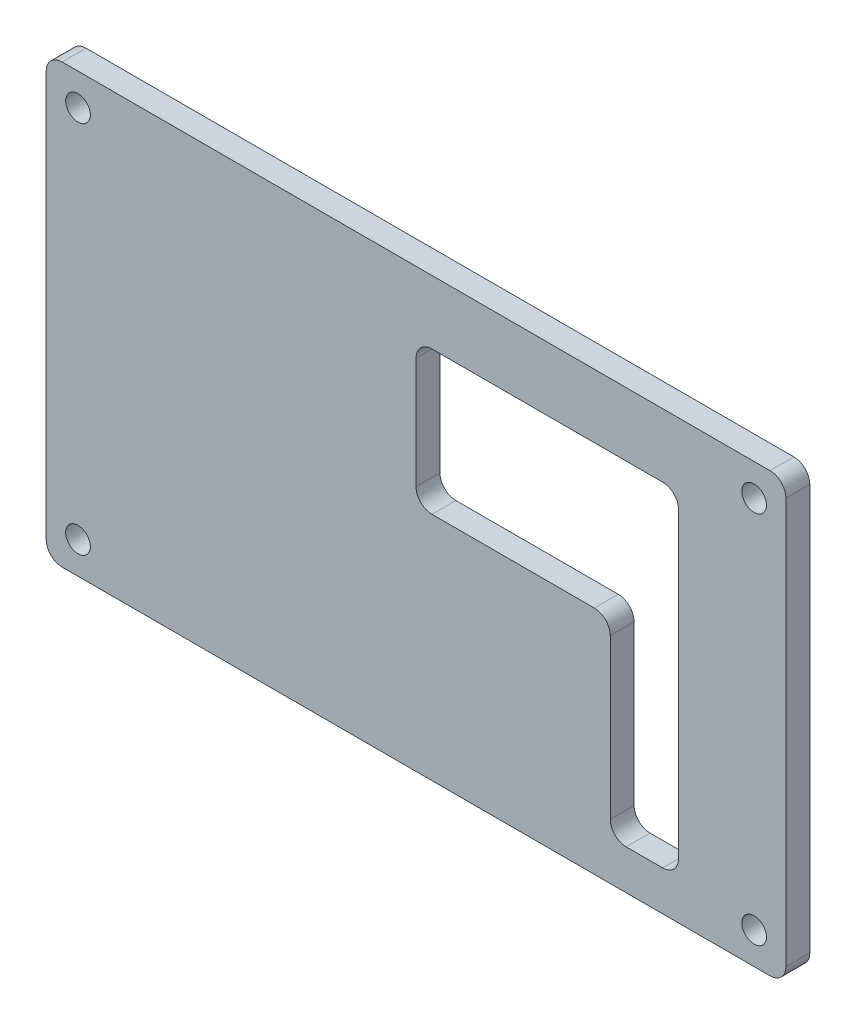
ISO-10303-21;
HEADER;
FILE_DESCRIPTION(('STEP AP214'),'2;1');
FILE_NAME('part.step','',(''),(''),'','','');
FILE_SCHEMA(('AUTOMOTIVE_DESIGN { 1 0 10303 214 1 1 1 1 }'));
ENDSEC;
DATA;
#1=APPLICATION_CONTEXT('core data for automotive mechanical design processes');
#2=APPLICATION_PROTOCOL_DEFINITION('international standard','automotive_design',2000,#1);
#3=PRODUCT_CONTEXT('',#1,'mechanical');
#4=PRODUCT('Part','Part','',(#3));
#5=PRODUCT_RELATED_PRODUCT_CATEGORY('part','',(#4));
#6=PRODUCT_DEFINITION_FORMATION('','',#4);
#7=PRODUCT_DEFINITION_CONTEXT('part definition',#1,'design');
#8=PRODUCT_DEFINITION('design','',#6,#7);
#9=PRODUCT_DEFINITION_SHAPE('','',#8);
#10=(LENGTH_UNIT() NAMED_UNIT(*) SI_UNIT(.MILLI.,.METRE.));
#11=(NAMED_UNIT(*) PLANE_ANGLE_UNIT() SI_UNIT($,.RADIAN.));
#12=(NAMED_UNIT(*) SI_UNIT($,.STERADIAN.) SOLID_ANGLE_UNIT());
#13=UNCERTAINTY_MEASURE_WITH_UNIT(LENGTH_MEASURE(1.E-05),#10,'distance_accuracy_value','');
#14=(GEOMETRIC_REPRESENTATION_CONTEXT(3) GLOBAL_UNCERTAINTY_ASSIGNED_CONTEXT((#13)) GLOBAL_UNIT_ASSIGNED_CONTEXT((#10,
#11,#12)) REPRESENTATION_CONTEXT('',''));
#15=CARTESIAN_POINT('',(0.,0.,0.));
#16=DIRECTION('',(0.,0.,1.));
#17=DIRECTION('',(1.,0.,0.));
#18=AXIS2_PLACEMENT_3D('',#15,#16,#17);
#19=CARTESIAN_POINT('',(44.5000000000009,25.5000000000001,3.));
#20=DIRECTION('',(0.,0.,1.));
#21=DIRECTION('',(1.,0.,0.));
#22=AXIS2_PLACEMENT_3D('',#19,#20,#21);
#23=PLANE('',#22);
#24=CARTESIAN_POINT('',(42.4999999999991,23.5000000000001,3.));
#25=DIRECTION('',(0.,0.,1.));
#26=DIRECTION('',(1.,0.,0.));
#27=AXIS2_PLACEMENT_3D('',#24,#25,#26);
#28=CIRCLE('',#27,1.54999999999994);
#29=CARTESIAN_POINT('',(44.049999999999,23.5000000000001,3.));
#30=VERTEX_POINT('',#29);
#31=EDGE_CURVE('E269',#30,#30,#28,.T.);
#32=ORIENTED_EDGE('',*,*,#31,.F.);
#33=EDGE_LOOP('',(#32));
#34=FACE_BOUND('',#33,.T.);
#35=CARTESIAN_POINT('',(-42.5000000000009,23.5000000000001,3.));
#36=DIRECTION('',(0.,0.,1.));
#37=DIRECTION('',(1.,0.,0.));
#38=AXIS2_PLACEMENT_3D('',#35,#36,#37);
#39=CIRCLE('',#38,1.54999999999994);
#40=CARTESIAN_POINT('',(-40.9500000000009,23.5000000000001,3.));
#41=VERTEX_POINT('',#40);
#42=EDGE_CURVE('E281',#41,#41,#39,.T.);
#43=ORIENTED_EDGE('',*,*,#42,.F.);
#44=EDGE_LOOP('',(#43));
#45=FACE_BOUND('',#44,.T.);
#46=CARTESIAN_POINT('',(44.5000000000009,25.5000000000001,3.));
#47=DIRECTION('',(0.,0.,1.));
#48=DIRECTION('',(1.,0.,0.));
#49=AXIS2_PLACEMENT_3D('',#46,#47,#48);
#50=CIRCLE('',#49,2.00000000000021);
#51=CARTESIAN_POINT('',(46.5000000000011,25.5000000000001,3.));
#52=VERTEX_POINT('',#51);
#53=CARTESIAN_POINT('',(44.5000000000009,27.5000000000003,3.));
#54=VERTEX_POINT('',#53);
#55=EDGE_CURVE('E287',#52,#54,#50,.T.);
#56=ORIENTED_EDGE('',*,*,#55,.T.);
#57=DIRECTION('',(-1.,0.,0.));
#58=VECTOR('',#57,1.);
#59=CARTESIAN_POINT('',(44.5000000000009,27.5000000000003,3.));
#60=LINE('',#59,#58);
#61=CARTESIAN_POINT('',(-44.4999999999995,27.5000000000001,3.));
#62=VERTEX_POINT('',#61);
#63=EDGE_CURVE('E290',#54,#62,#60,.T.);
#64=ORIENTED_EDGE('',*,*,#63,.T.);
#65=CARTESIAN_POINT('',(-44.4999999999995,25.5000000000001,3.));
#66=DIRECTION('',(0.,0.,1.));
#67=DIRECTION('',(1.,0.,0.));
#68=AXIS2_PLACEMENT_3D('',#65,#66,#67);
#69=CIRCLE('',#68,2.);
#70=CARTESIAN_POINT('',(-46.4999999999995,25.5000000000001,3.));
#71=VERTEX_POINT('',#70);
#72=EDGE_CURVE('E293',#62,#71,#69,.T.);
#73=ORIENTED_EDGE('',*,*,#72,.T.);
#74=DIRECTION('',(0.,-1.,0.));
#75=VECTOR('',#74,1.);
#76=CARTESIAN_POINT('',(-46.4999999999995,25.5000000000001,3.));
#77=LINE('',#76,#75);
#78=CARTESIAN_POINT('',(-46.4999999999995,-25.5,3.));
#79=VERTEX_POINT('',#78);
#80=EDGE_CURVE('E295',#71,#79,#77,.T.);
#81=ORIENTED_EDGE('',*,*,#80,.T.);
#82=CARTESIAN_POINT('',(-44.4999999999998,-25.5,3.));
#83=DIRECTION('',(0.,0.,1.));
#84=DIRECTION('',(1.,0.,0.));
#85=AXIS2_PLACEMENT_3D('',#82,#83,#84);
#86=CIRCLE('',#85,1.99999999999977);
#87=CARTESIAN_POINT('',(-44.4999999999998,-27.4999999999995,3.));
#88=VERTEX_POINT('',#87);
#89=EDGE_CURVE('E297',#79,#88,#86,.T.);
#90=ORIENTED_EDGE('',*,*,#89,.T.);
#91=DIRECTION('',(1.,0.,0.));
#92=VECTOR('',#91,1.);
#93=CARTESIAN_POINT('',(-44.4999999999998,-27.4999999999995,3.));
#94=LINE('',#93,#92);
#95=CARTESIAN_POINT('',(44.5000000000011,-27.4999999999997,3.));
#96=VERTEX_POINT('',#95);
#97=EDGE_CURVE('E299',#88,#96,#94,.T.);
#98=ORIENTED_EDGE('',*,*,#97,.T.);
#99=CARTESIAN_POINT('',(44.5000000000011,-25.5,3.));
#100=DIRECTION('',(0.,0.,1.));
#101=DIRECTION('',(1.,0.,0.));
#102=AXIS2_PLACEMENT_3D('',#99,#100,#101);
#103=CIRCLE('',#102,1.99999999999976);
#104=CARTESIAN_POINT('',(46.5000000000004,-25.4999999999995,3.));
#105=VERTEX_POINT('',#104);
#106=EDGE_CURVE('E301',#96,#105,#103,.T.);
#107=ORIENTED_EDGE('',*,*,#106,.T.);
#108=DIRECTION('',(0.,1.,0.));
#109=VECTOR('',#108,1.);
#110=CARTESIAN_POINT('',(46.5000000000004,-25.4999999999995,3.));
#111=LINE('',#110,#109);
#112=EDGE_CURVE('E303',#105,#52,#111,.T.);
#113=ORIENTED_EDGE('',*,*,#112,.T.);
#114=EDGE_LOOP('',(#56,#64,#73,#81,#90,#98,#107,#113));
#115=FACE_BOUND('',#114,.T.);
#116=CARTESIAN_POINT('',(-42.5000000000009,-23.5,3.));
#117=DIRECTION('',(0.,0.,1.));
#118=DIRECTION('',(1.,0.,0.));
#119=AXIS2_PLACEMENT_3D('',#116,#117,#118);
#120=CIRCLE('',#119,1.54999999999994);
#121=CARTESIAN_POINT('',(-40.9500000000009,-23.5,3.));
#122=VERTEX_POINT('',#121);
#123=EDGE_CURVE('E275',#122,#122,#120,.T.);
#124=ORIENTED_EDGE('',*,*,#123,.F.);
#125=EDGE_LOOP('',(#124));
#126=FACE_BOUND('',#125,.T.);
#127=CARTESIAN_POINT('',(42.4999999999991,-23.5,3.));
#128=DIRECTION('',(0.,0.,1.));
#129=DIRECTION('',(1.,0.,0.));
#130=AXIS2_PLACEMENT_3D('',#127,#128,#129);
#131=CIRCLE('',#130,1.54999999999994);
#132=CARTESIAN_POINT('',(44.049999999999,-23.5,3.));
#133=VERTEX_POINT('',#132);
#134=EDGE_CURVE('E263',#133,#133,#131,.T.);
#135=ORIENTED_EDGE('',*,*,#134,.F.);
#136=EDGE_LOOP('',(#135));
#137=FACE_BOUND('',#136,.T.);
#138=DIRECTION('',(0.,-1.,0.));
#139=VECTOR('',#138,1.);
#140=CARTESIAN_POINT('',(1.13103970633688E-12,17.5000000000012,3.));
#141=LINE('',#140,#139);
#142=CARTESIAN_POINT('',(1.13103970633688E-12,17.5000000000012,3.));
#143=VERTEX_POINT('',#142);
#144=CARTESIAN_POINT('',(9.14199271839777E-13,3.50000000000107,3.));
#145=VERTEX_POINT('',#144);
#146=EDGE_CURVE('E178',#143,#145,#141,.T.);
#147=ORIENTED_EDGE('',*,*,#146,.F.);
#148=CARTESIAN_POINT('',(2.00000000000135,17.5000000000005,3.));
#149=DIRECTION('',(0.,0.,1.));
#150=DIRECTION('',(1.,0.,0.));
#151=AXIS2_PLACEMENT_3D('',#148,#149,#150);
#152=CIRCLE('',#151,1.99999999999978);
#153=CARTESIAN_POINT('',(2.00000000000154,19.4999999999998,3.));
#154=VERTEX_POINT('',#153);
#155=EDGE_CURVE('E170',#154,#143,#152,.T.);
#156=ORIENTED_EDGE('',*,*,#155,.F.);
#157=DIRECTION('',(-1.,0.,0.));
#158=VECTOR('',#157,1.);
#159=CARTESIAN_POINT('',(31.0000000000017,19.4999999999998,3.));
#160=LINE('',#159,#158);
#161=CARTESIAN_POINT('',(31.0000000000017,19.4999999999998,3.));
#162=VERTEX_POINT('',#161);
#163=EDGE_CURVE('E211',#162,#154,#160,.T.);
#164=ORIENTED_EDGE('',*,*,#163,.F.);
#165=CARTESIAN_POINT('',(31.0000000000028,17.5000000000003,3.));
#166=DIRECTION('',(0.,0.,1.));
#167=DIRECTION('',(1.,0.,0.));
#168=AXIS2_PLACEMENT_3D('',#165,#166,#167);
#169=CIRCLE('',#168,1.99999999999973);
#170=CARTESIAN_POINT('',(33.0000000000025,17.5000000000012,3.));
#171=VERTEX_POINT('',#170);
#172=EDGE_CURVE('E209',#171,#162,#169,.T.);
#173=ORIENTED_EDGE('',*,*,#172,.F.);
#174=DIRECTION('',(0.,1.,0.));
#175=VECTOR('',#174,1.);
#176=CARTESIAN_POINT('',(33.0000000000027,-20.4999999999986,3.));
#177=LINE('',#176,#175);
#178=CARTESIAN_POINT('',(33.0000000000027,-20.4999999999986,3.));
#179=VERTEX_POINT('',#178);
#180=EDGE_CURVE('E207',#179,#171,#177,.T.);
#181=ORIENTED_EDGE('',*,*,#180,.F.);
#182=CARTESIAN_POINT('',(31.000000000003,-20.4999999999992,3.));
#183=DIRECTION('',(0.,0.,1.));
#184=DIRECTION('',(1.,0.,0.));
#185=AXIS2_PLACEMENT_3D('',#182,#183,#184);
#186=CIRCLE('',#185,2.00000000000022);
#187=CARTESIAN_POINT('',(31.000000000003,-22.4999999999994,3.));
#188=VERTEX_POINT('',#187);
#189=EDGE_CURVE('E205',#188,#179,#186,.T.);
#190=ORIENTED_EDGE('',*,*,#189,.F.);
#191=DIRECTION('',(1.,0.,0.));
#192=VECTOR('',#191,1.);
#193=CARTESIAN_POINT('',(26.4132142617397,-22.4999999999999,3.));
#194=LINE('',#193,#192);
#195=CARTESIAN_POINT('',(26.4132142617397,-22.4999999999999,3.));
#196=VERTEX_POINT('',#195);
#197=EDGE_CURVE('E203',#196,#188,#194,.T.);
#198=ORIENTED_EDGE('',*,*,#197,.F.);
#199=CARTESIAN_POINT('',(26.4132142617396,-20.4999999999992,3.));
#200=DIRECTION('',(0.,0.,1.));
#201=DIRECTION('',(1.,0.,0.));
#202=AXIS2_PLACEMENT_3D('',#199,#200,#201);
#203=CIRCLE('',#202,2.00000000000044);
#204=CARTESIAN_POINT('',(24.4132142617392,-20.4999999999984,3.));
#205=VERTEX_POINT('',#204);
#206=EDGE_CURVE('E201',#205,#196,#203,.T.);
#207=ORIENTED_EDGE('',*,*,#206,.F.);
#208=DIRECTION('',(0.,-1.,0.));
#209=VECTOR('',#208,1.);
#210=CARTESIAN_POINT('',(24.4132142617394,-0.499999999998928,3.));
#211=LINE('',#210,#209);
#212=CARTESIAN_POINT('',(24.4132142617394,-0.499999999998928,3.));
#213=VERTEX_POINT('',#212);
#214=EDGE_CURVE('E199',#213,#205,#211,.T.);
#215=ORIENTED_EDGE('',*,*,#214,.F.);
#216=CARTESIAN_POINT('',(22.4132142617396,-0.499999999999761,3.));
#217=DIRECTION('',(0.,0.,-1.));
#218=DIRECTION('',(1.,0.,0.));
#219=AXIS2_PLACEMENT_3D('',#216,#217,#218);
#220=CIRCLE('',#219,1.99999999999956);
#221=CARTESIAN_POINT('',(22.4132142617397,1.4999999999998,3.));
#222=VERTEX_POINT('',#221);
#223=EDGE_CURVE('E197',#222,#213,#220,.T.);
#224=ORIENTED_EDGE('',*,*,#223,.F.);
#225=DIRECTION('',(1.,0.,0.));
#226=VECTOR('',#225,1.);
#227=CARTESIAN_POINT('',(2.00000000000333,1.49999999999958,3.));
#228=LINE('',#227,#226);
#229=CARTESIAN_POINT('',(2.00000000000333,1.49999999999958,3.));
#230=VERTEX_POINT('',#229);
#231=EDGE_CURVE('E193',#230,#222,#228,.T.);
#232=ORIENTED_EDGE('',*,*,#231,.F.);
#233=CARTESIAN_POINT('',(2.00000000000136,3.50000000000024,3.));
#234=DIRECTION('',(0.,0.,1.));
#235=DIRECTION('',(1.,0.,0.));
#236=AXIS2_PLACEMENT_3D('',#233,#234,#235);
#237=CIRCLE('',#236,2.00000000000044);
#238=EDGE_CURVE('E191',#145,#230,#237,.T.);
#239=ORIENTED_EDGE('',*,*,#238,.F.);
#240=EDGE_LOOP('',(#147,#156,#164,#173,#181,#190,#198,#207,#215,#224,#232,#239));
#241=FACE_BOUND('',#240,.T.);
#242=ADVANCED_FACE('F33',(#34,#45,#115,#126,#137,#241),#23,.T.);
#243=CARTESIAN_POINT('',(44.5000000000009,25.5000000000001,0.));
#244=DIRECTION('',(0.,0.,1.));
#245=DIRECTION('',(1.,0.,0.));
#246=AXIS2_PLACEMENT_3D('',#243,#244,#245);
#247=PLANE('',#246);
#248=CARTESIAN_POINT('',(42.4999999999991,-23.5,0.));
#249=DIRECTION('',(0.,0.,1.));
#250=DIRECTION('',(1.,0.,0.));
#251=AXIS2_PLACEMENT_3D('',#248,#249,#250);
#252=CIRCLE('',#251,1.54999999999994);
#253=CARTESIAN_POINT('',(44.049999999999,-23.5,0.));
#254=VERTEX_POINT('',#253);
#255=EDGE_CURVE('E186',#254,#254,#252,.T.);
#256=ORIENTED_EDGE('',*,*,#255,.T.);
#257=EDGE_LOOP('',(#256));
#258=FACE_BOUND('',#257,.T.);
#259=CARTESIAN_POINT('',(42.4999999999991,23.5000000000001,0.));
#260=DIRECTION('',(0.,0.,1.));
#261=DIRECTION('',(1.,0.,0.));
#262=AXIS2_PLACEMENT_3D('',#259,#260,#261);
#263=CIRCLE('',#262,1.54999999999994);
#264=CARTESIAN_POINT('',(44.049999999999,23.5000000000001,0.));
#265=VERTEX_POINT('',#264);
#266=EDGE_CURVE('E266',#265,#265,#263,.T.);
#267=ORIENTED_EDGE('',*,*,#266,.T.);
#268=EDGE_LOOP('',(#267));
#269=FACE_BOUND('',#268,.T.);
#270=CARTESIAN_POINT('',(-42.5000000000009,-23.5,0.));
#271=DIRECTION('',(0.,0.,1.));
#272=DIRECTION('',(1.,0.,0.));
#273=AXIS2_PLACEMENT_3D('',#270,#271,#272);
#274=CIRCLE('',#273,1.54999999999994);
#275=CARTESIAN_POINT('',(-40.9500000000009,-23.5,0.));
#276=VERTEX_POINT('',#275);
#277=EDGE_CURVE('E272',#276,#276,#274,.T.);
#278=ORIENTED_EDGE('',*,*,#277,.T.);
#279=EDGE_LOOP('',(#278));
#280=FACE_BOUND('',#279,.T.);
#281=CARTESIAN_POINT('',(-42.5000000000009,23.5000000000001,0.));
#282=DIRECTION('',(0.,0.,1.));
#283=DIRECTION('',(1.,0.,0.));
#284=AXIS2_PLACEMENT_3D('',#281,#282,#283);
#285=CIRCLE('',#284,1.54999999999994);
#286=CARTESIAN_POINT('',(-40.9500000000009,23.5000000000001,0.));
#287=VERTEX_POINT('',#286);
#288=EDGE_CURVE('E278',#287,#287,#285,.T.);
#289=ORIENTED_EDGE('',*,*,#288,.T.);
#290=EDGE_LOOP('',(#289));
#291=FACE_BOUND('',#290,.T.);
#292=CARTESIAN_POINT('',(44.5000000000009,25.5000000000001,0.));
#293=DIRECTION('',(0.,0.,1.));
#294=DIRECTION('',(1.,0.,0.));
#295=AXIS2_PLACEMENT_3D('',#292,#293,#294);
#296=CIRCLE('',#295,2.00000000000021);
#297=CARTESIAN_POINT('',(46.5000000000011,25.5000000000001,0.));
#298=VERTEX_POINT('',#297);
#299=CARTESIAN_POINT('',(44.5000000000009,27.5000000000003,0.));
#300=VERTEX_POINT('',#299);
#301=EDGE_CURVE('E284',#298,#300,#296,.T.);
#302=ORIENTED_EDGE('',*,*,#301,.F.);
#303=DIRECTION('',(0.,1.,0.));
#304=VECTOR('',#303,1.);
#305=CARTESIAN_POINT('',(46.5000000000004,-25.4999999999995,0.));
#306=LINE('',#305,#304);
#307=CARTESIAN_POINT('',(46.5000000000004,-25.4999999999995,0.));
#308=VERTEX_POINT('',#307);
#309=EDGE_CURVE('E291',#308,#298,#306,.T.);
#310=ORIENTED_EDGE('',*,*,#309,.F.);
#311=CARTESIAN_POINT('',(44.5000000000011,-25.5,0.));
#312=DIRECTION('',(0.,0.,1.));
#313=DIRECTION('',(1.,0.,0.));
#314=AXIS2_PLACEMENT_3D('',#311,#312,#313);
#315=CIRCLE('',#314,1.99999999999976);
#316=CARTESIAN_POINT('',(44.5000000000011,-27.4999999999997,0.));
#317=VERTEX_POINT('',#316);
#318=EDGE_CURVE('E318',#317,#308,#315,.T.);
#319=ORIENTED_EDGE('',*,*,#318,.F.);
#320=DIRECTION('',(1.,0.,0.));
#321=VECTOR('',#320,1.);
#322=CARTESIAN_POINT('',(-44.4999999999998,-27.4999999999995,0.));
#323=LINE('',#322,#321);
#324=CARTESIAN_POINT('',(-44.4999999999998,-27.4999999999995,0.));
#325=VERTEX_POINT('',#324);
#326=EDGE_CURVE('E316',#325,#317,#323,.T.);
#327=ORIENTED_EDGE('',*,*,#326,.F.);
#328=CARTESIAN_POINT('',(-44.4999999999998,-25.5,0.));
#329=DIRECTION('',(0.,0.,1.));
#330=DIRECTION('',(1.,0.,0.));
#331=AXIS2_PLACEMENT_3D('',#328,#329,#330);
#332=CIRCLE('',#331,1.99999999999977);
#333=CARTESIAN_POINT('',(-46.4999999999995,-25.5,0.));
#334=VERTEX_POINT('',#333);
#335=EDGE_CURVE('E314',#334,#325,#332,.T.);
#336=ORIENTED_EDGE('',*,*,#335,.F.);
#337=DIRECTION('',(0.,-1.,0.));
#338=VECTOR('',#337,1.);
#339=CARTESIAN_POINT('',(-46.4999999999995,25.5000000000001,0.));
#340=LINE('',#339,#338);
#341=CARTESIAN_POINT('',(-46.4999999999995,25.5000000000001,0.));
#342=VERTEX_POINT('',#341);
#343=EDGE_CURVE('E312',#342,#334,#340,.T.);
#344=ORIENTED_EDGE('',*,*,#343,.F.);
#345=CARTESIAN_POINT('',(-44.4999999999995,25.5000000000001,0.));
#346=DIRECTION('',(0.,0.,1.));
#347=DIRECTION('',(1.,0.,0.));
#348=AXIS2_PLACEMENT_3D('',#345,#346,#347);
#349=CIRCLE('',#348,2.);
#350=CARTESIAN_POINT('',(-44.4999999999995,27.5000000000001,0.));
#351=VERTEX_POINT('',#350);
#352=EDGE_CURVE('E310',#351,#342,#349,.T.);
#353=ORIENTED_EDGE('',*,*,#352,.F.);
#354=DIRECTION('',(-1.,0.,0.));
#355=VECTOR('',#354,1.);
#356=CARTESIAN_POINT('',(44.5000000000009,27.5000000000003,0.));
#357=LINE('',#356,#355);
#358=EDGE_CURVE('E308',#300,#351,#357,.T.);
#359=ORIENTED_EDGE('',*,*,#358,.F.);
#360=EDGE_LOOP('',(#302,#310,#319,#327,#336,#344,#353,#359));
#361=FACE_BOUND('',#360,.T.);
#362=CARTESIAN_POINT('',(2.00000000000135,17.5000000000005,0.));
#363=DIRECTION('',(0.,0.,1.));
#364=DIRECTION('',(1.,0.,0.));
#365=AXIS2_PLACEMENT_3D('',#362,#363,#364);
#366=CIRCLE('',#365,1.99999999999978);
#367=CARTESIAN_POINT('',(2.00000000000154,19.4999999999998,0.));
#368=VERTEX_POINT('',#367);
#369=CARTESIAN_POINT('',(1.13103970633688E-12,17.5000000000012,0.));
#370=VERTEX_POINT('',#369);
#371=EDGE_CURVE('E56',#368,#370,#366,.T.);
#372=ORIENTED_EDGE('',*,*,#371,.T.);
#373=DIRECTION('',(0.,-1.,0.));
#374=VECTOR('',#373,1.);
#375=CARTESIAN_POINT('',(1.13103970633688E-12,17.5000000000012,0.));
#376=LINE('',#375,#374);
#377=CARTESIAN_POINT('',(9.14199271839777E-13,3.50000000000107,0.));
#378=VERTEX_POINT('',#377);
#379=EDGE_CURVE('E185',#370,#378,#376,.T.);
#380=ORIENTED_EDGE('',*,*,#379,.T.);
#381=CARTESIAN_POINT('',(2.00000000000136,3.50000000000024,0.));
#382=DIRECTION('',(0.,0.,1.));
#383=DIRECTION('',(1.,0.,0.));
#384=AXIS2_PLACEMENT_3D('',#381,#382,#383);
#385=CIRCLE('',#384,2.00000000000044);
#386=CARTESIAN_POINT('',(2.00000000000333,1.49999999999958,0.));
#387=VERTEX_POINT('',#386);
#388=EDGE_CURVE('E215',#378,#387,#385,.T.);
#389=ORIENTED_EDGE('',*,*,#388,.T.);
#390=DIRECTION('',(1.,0.,0.));
#391=VECTOR('',#390,1.);
#392=CARTESIAN_POINT('',(2.00000000000333,1.49999999999958,0.));
#393=LINE('',#392,#391);
#394=CARTESIAN_POINT('',(22.4132142617397,1.4999999999998,0.));
#395=VERTEX_POINT('',#394);
#396=EDGE_CURVE('E218',#387,#395,#393,.T.);
#397=ORIENTED_EDGE('',*,*,#396,.T.);
#398=CARTESIAN_POINT('',(22.4132142617396,-0.499999999999761,0.));
#399=DIRECTION('',(0.,0.,-1.));
#400=DIRECTION('',(1.,0.,0.));
#401=AXIS2_PLACEMENT_3D('',#398,#399,#400);
#402=CIRCLE('',#401,1.99999999999956);
#403=CARTESIAN_POINT('',(24.4132142617394,-0.499999999998928,0.));
#404=VERTEX_POINT('',#403);
#405=EDGE_CURVE('E221',#395,#404,#402,.T.);
#406=ORIENTED_EDGE('',*,*,#405,.T.);
#407=DIRECTION('',(0.,-1.,0.));
#408=VECTOR('',#407,1.);
#409=CARTESIAN_POINT('',(24.4132142617394,-0.499999999998928,0.));
#410=LINE('',#409,#408);
#411=CARTESIAN_POINT('',(24.4132142617392,-20.4999999999984,0.));
#412=VERTEX_POINT('',#411);
#413=EDGE_CURVE('E224',#404,#412,#410,.T.);
#414=ORIENTED_EDGE('',*,*,#413,.T.);
#415=CARTESIAN_POINT('',(26.4132142617396,-20.4999999999992,0.));
#416=DIRECTION('',(0.,0.,1.));
#417=DIRECTION('',(1.,0.,0.));
#418=AXIS2_PLACEMENT_3D('',#415,#416,#417);
#419=CIRCLE('',#418,2.00000000000044);
#420=CARTESIAN_POINT('',(26.4132142617397,-22.4999999999999,0.));
#421=VERTEX_POINT('',#420);
#422=EDGE_CURVE('E227',#412,#421,#419,.T.);
#423=ORIENTED_EDGE('',*,*,#422,.T.);
#424=DIRECTION('',(1.,0.,0.));
#425=VECTOR('',#424,1.);
#426=CARTESIAN_POINT('',(26.4132142617397,-22.4999999999999,0.));
#427=LINE('',#426,#425);
#428=CARTESIAN_POINT('',(31.000000000003,-22.4999999999994,0.));
#429=VERTEX_POINT('',#428);
#430=EDGE_CURVE('E230',#421,#429,#427,.T.);
#431=ORIENTED_EDGE('',*,*,#430,.T.);
#432=CARTESIAN_POINT('',(31.000000000003,-20.4999999999992,0.));
#433=DIRECTION('',(0.,0.,1.));
#434=DIRECTION('',(1.,0.,0.));
#435=AXIS2_PLACEMENT_3D('',#432,#433,#434);
#436=CIRCLE('',#435,2.00000000000022);
#437=CARTESIAN_POINT('',(33.0000000000027,-20.4999999999986,0.));
#438=VERTEX_POINT('',#437);
#439=EDGE_CURVE('E233',#429,#438,#436,.T.);
#440=ORIENTED_EDGE('',*,*,#439,.T.);
#441=DIRECTION('',(0.,1.,0.));
#442=VECTOR('',#441,1.);
#443=CARTESIAN_POINT('',(33.0000000000027,-20.4999999999986,0.));
#444=LINE('',#443,#442);
#445=CARTESIAN_POINT('',(33.0000000000025,17.5000000000012,0.));
#446=VERTEX_POINT('',#445);
#447=EDGE_CURVE('E236',#438,#446,#444,.T.);
#448=ORIENTED_EDGE('',*,*,#447,.T.);
#449=CARTESIAN_POINT('',(31.0000000000028,17.5000000000003,0.));
#450=DIRECTION('',(0.,0.,1.));
#451=DIRECTION('',(1.,0.,0.));
#452=AXIS2_PLACEMENT_3D('',#449,#450,#451);
#453=CIRCLE('',#452,1.99999999999973);
#454=CARTESIAN_POINT('',(31.0000000000017,19.4999999999998,0.));
#455=VERTEX_POINT('',#454);
#456=EDGE_CURVE('E239',#446,#455,#453,.T.);
#457=ORIENTED_EDGE('',*,*,#456,.T.);
#458=DIRECTION('',(-1.,0.,0.));
#459=VECTOR('',#458,1.);
#460=CARTESIAN_POINT('',(31.0000000000017,19.4999999999998,0.));
#461=LINE('',#460,#459);
#462=EDGE_CURVE('E179',#455,#368,#461,.T.);
#463=ORIENTED_EDGE('',*,*,#462,.T.);
#464=EDGE_LOOP('',(#372,#380,#389,#397,#406,#414,#423,#431,#440,#448,#457,#463));
#465=FACE_BOUND('',#464,.T.);
#466=ADVANCED_FACE('F348',(#258,#269,#280,#291,#361,#465),#247,.F.);
#467=CARTESIAN_POINT('',(44.5000000000009,25.5000000000001,3.));
#468=DIRECTION('',(0.,0.,-1.));
#469=DIRECTION('',(-1.,0.,0.));
#470=AXIS2_PLACEMENT_3D('',#467,#468,#469);
#471=CYLINDRICAL_SURFACE('',#470,2.00000000000021);
#472=ORIENTED_EDGE('',*,*,#301,.T.);
#473=DIRECTION('',(0.,0.,-1.));
#474=VECTOR('',#473,1.);
#475=CARTESIAN_POINT('',(44.5000000000009,27.5000000000003,3.));
#476=LINE('',#475,#474);
#477=EDGE_CURVE('E11',#54,#300,#476,.T.);
#478=ORIENTED_EDGE('',*,*,#477,.F.);
#479=ORIENTED_EDGE('',*,*,#55,.F.);
#480=DIRECTION('',(0.,0.,-1.));
#481=VECTOR('',#480,1.);
#482=CARTESIAN_POINT('',(46.5000000000011,25.5000000000001,3.));
#483=LINE('',#482,#481);
#484=EDGE_CURVE('E305',#52,#298,#483,.T.);
#485=ORIENTED_EDGE('',*,*,#484,.T.);
#486=EDGE_LOOP('',(#472,#478,#479,#485));
#487=FACE_BOUND('',#486,.T.);
#488=ADVANCED_FACE('F35',(#487),#471,.T.);
#489=CARTESIAN_POINT('',(44.5000000000009,27.5000000000003,3.));
#490=DIRECTION('',(0.,-1.,0.));
#491=DIRECTION('',(1.,0.,0.));
#492=AXIS2_PLACEMENT_3D('',#489,#490,#491);
#493=PLANE('',#492);
#494=ORIENTED_EDGE('',*,*,#358,.T.);
#495=DIRECTION('',(0.,0.,-1.));
#496=VECTOR('',#495,1.);
#497=CARTESIAN_POINT('',(-44.4999999999995,27.5000000000001,3.));
#498=LINE('',#497,#496);
#499=EDGE_CURVE('E41',#62,#351,#498,.T.);
#500=ORIENTED_EDGE('',*,*,#499,.F.);
#501=ORIENTED_EDGE('',*,*,#63,.F.);
#502=ORIENTED_EDGE('',*,*,#477,.T.);
#503=EDGE_LOOP('',(#494,#500,#501,#502));
#504=FACE_BOUND('',#503,.T.);
#505=ADVANCED_FACE('F366',(#504),#493,.F.);
#506=CARTESIAN_POINT('',(-44.4999999999995,25.5000000000001,3.));
#507=DIRECTION('',(0.,0.,-1.));
#508=DIRECTION('',(-1.,0.,0.));
#509=AXIS2_PLACEMENT_3D('',#506,#507,#508);
#510=CYLINDRICAL_SURFACE('',#509,2.);
#511=ORIENTED_EDGE('',*,*,#352,.T.);
#512=DIRECTION('',(0.,0.,-1.));
#513=VECTOR('',#512,1.);
#514=CARTESIAN_POINT('',(-46.4999999999995,25.5000000000001,3.));
#515=LINE('',#514,#513);
#516=EDGE_CURVE('E335',#71,#342,#515,.T.);
#517=ORIENTED_EDGE('',*,*,#516,.F.);
#518=ORIENTED_EDGE('',*,*,#72,.F.);
#519=ORIENTED_EDGE('',*,*,#499,.T.);
#520=EDGE_LOOP('',(#511,#517,#518,#519));
#521=FACE_BOUND('',#520,.T.);
#522=ADVANCED_FACE('F342',(#521),#510,.T.);
#523=CARTESIAN_POINT('',(-46.4999999999995,25.5000000000001,3.));
#524=DIRECTION('',(1.,0.,0.));
#525=DIRECTION('',(0.,1.,0.));
#526=AXIS2_PLACEMENT_3D('',#523,#524,#525);
#527=PLANE('',#526);
#528=ORIENTED_EDGE('',*,*,#343,.T.);
#529=DIRECTION('',(0.,0.,-1.));
#530=VECTOR('',#529,1.);
#531=CARTESIAN_POINT('',(-46.4999999999995,-25.5,3.));
#532=LINE('',#531,#530);
#533=EDGE_CURVE('E332',#79,#334,#532,.T.);
#534=ORIENTED_EDGE('',*,*,#533,.F.);
#535=ORIENTED_EDGE('',*,*,#80,.F.);
#536=ORIENTED_EDGE('',*,*,#516,.T.);
#537=EDGE_LOOP('',(#528,#534,#535,#536));
#538=FACE_BOUND('',#537,.T.);
#539=ADVANCED_FACE('F354',(#538),#527,.F.);
#540=CARTESIAN_POINT('',(-44.4999999999998,-25.5,3.));
#541=DIRECTION('',(0.,0.,-1.));
#542=DIRECTION('',(-1.,0.,0.));
#543=AXIS2_PLACEMENT_3D('',#540,#541,#542);
#544=CYLINDRICAL_SURFACE('',#543,1.99999999999977);
#545=ORIENTED_EDGE('',*,*,#335,.T.);
#546=DIRECTION('',(0.,0.,-1.));
#547=VECTOR('',#546,1.);
#548=CARTESIAN_POINT('',(-44.4999999999998,-27.4999999999995,3.));
#549=LINE('',#548,#547);
#550=EDGE_CURVE('E329',#88,#325,#549,.T.);
#551=ORIENTED_EDGE('',*,*,#550,.F.);
#552=ORIENTED_EDGE('',*,*,#89,.F.);
#553=ORIENTED_EDGE('',*,*,#533,.T.);
#554=EDGE_LOOP('',(#545,#551,#552,#553));
#555=FACE_BOUND('',#554,.T.);
#556=ADVANCED_FACE('F358',(#555),#544,.T.);
#557=CARTESIAN_POINT('',(-44.4999999999998,-27.4999999999995,3.));
#558=DIRECTION('',(0.,1.,0.));
#559=DIRECTION('',(-1.,0.,0.));
#560=AXIS2_PLACEMENT_3D('',#557,#558,#559);
#561=PLANE('',#560);
#562=ORIENTED_EDGE('',*,*,#326,.T.);
#563=DIRECTION('',(0.,0.,-1.));
#564=VECTOR('',#563,1.);
#565=CARTESIAN_POINT('',(44.5000000000011,-27.4999999999997,3.));
#566=LINE('',#565,#564);
#567=EDGE_CURVE('E326',#96,#317,#566,.T.);
#568=ORIENTED_EDGE('',*,*,#567,.F.);
#569=ORIENTED_EDGE('',*,*,#97,.F.);
#570=ORIENTED_EDGE('',*,*,#550,.T.);
#571=EDGE_LOOP('',(#562,#568,#569,#570));
#572=FACE_BOUND('',#571,.T.);
#573=ADVANCED_FACE('F379',(#572),#561,.F.);
#574=CARTESIAN_POINT('',(44.5000000000011,-25.5,3.));
#575=DIRECTION('',(0.,0.,-1.));
#576=DIRECTION('',(-1.,0.,0.));
#577=AXIS2_PLACEMENT_3D('',#574,#575,#576);
#578=CYLINDRICAL_SURFACE('',#577,1.99999999999976);
#579=ORIENTED_EDGE('',*,*,#318,.T.);
#580=DIRECTION('',(0.,0.,-1.));
#581=VECTOR('',#580,1.);
#582=CARTESIAN_POINT('',(46.5000000000004,-25.4999999999995,3.));
#583=LINE('',#582,#581);
#584=EDGE_CURVE('E323',#105,#308,#583,.T.);
#585=ORIENTED_EDGE('',*,*,#584,.F.);
#586=ORIENTED_EDGE('',*,*,#106,.F.);
#587=ORIENTED_EDGE('',*,*,#567,.T.);
#588=EDGE_LOOP('',(#579,#585,#586,#587));
#589=FACE_BOUND('',#588,.T.);
#590=ADVANCED_FACE('F377',(#589),#578,.T.);
#591=CARTESIAN_POINT('',(46.5000000000004,-25.4999999999995,3.));
#592=DIRECTION('',(-1.,0.,0.));
#593=DIRECTION('',(0.,-1.,0.));
#594=AXIS2_PLACEMENT_3D('',#591,#592,#593);
#595=PLANE('',#594);
#596=ORIENTED_EDGE('',*,*,#309,.T.);
#597=ORIENTED_EDGE('',*,*,#484,.F.);
#598=ORIENTED_EDGE('',*,*,#112,.F.);
#599=ORIENTED_EDGE('',*,*,#584,.T.);
#600=EDGE_LOOP('',(#596,#597,#598,#599));
#601=FACE_BOUND('',#600,.T.);
#602=ADVANCED_FACE('F372',(#601),#595,.F.);
#603=CARTESIAN_POINT('',(-42.5000000000009,23.5000000000001,3.));
#604=DIRECTION('',(0.,0.,-1.));
#605=DIRECTION('',(-1.,0.,0.));
#606=AXIS2_PLACEMENT_3D('',#603,#604,#605);
#607=CYLINDRICAL_SURFACE('',#606,1.54999999999994);
#608=ORIENTED_EDGE('',*,*,#42,.T.);
#609=EDGE_LOOP('',(#608));
#610=FACE_BOUND('',#609,.T.);
#611=ORIENTED_EDGE('',*,*,#288,.F.);
#612=EDGE_LOOP('',(#611));
#613=FACE_BOUND('',#612,.T.);
#614=ADVANCED_FACE('F399',(#610,#613),#607,.F.);
#615=CARTESIAN_POINT('',(-42.5000000000009,-23.5,3.));
#616=DIRECTION('',(0.,0.,-1.));
#617=DIRECTION('',(-1.,0.,0.));
#618=AXIS2_PLACEMENT_3D('',#615,#616,#617);
#619=CYLINDRICAL_SURFACE('',#618,1.54999999999994);
#620=ORIENTED_EDGE('',*,*,#123,.T.);
#621=EDGE_LOOP('',(#620));
#622=FACE_BOUND('',#621,.T.);
#623=ORIENTED_EDGE('',*,*,#277,.F.);
#624=EDGE_LOOP('',(#623));
#625=FACE_BOUND('',#624,.T.);
#626=ADVANCED_FACE('F406',(#622,#625),#619,.F.);
#627=CARTESIAN_POINT('',(42.4999999999991,23.5000000000001,3.));
#628=DIRECTION('',(0.,0.,-1.));
#629=DIRECTION('',(-1.,0.,0.));
#630=AXIS2_PLACEMENT_3D('',#627,#628,#629);
#631=CYLINDRICAL_SURFACE('',#630,1.54999999999994);
#632=ORIENTED_EDGE('',*,*,#31,.T.);
#633=EDGE_LOOP('',(#632));
#634=FACE_BOUND('',#633,.T.);
#635=ORIENTED_EDGE('',*,*,#266,.F.);
#636=EDGE_LOOP('',(#635));
#637=FACE_BOUND('',#636,.T.);
#638=ADVANCED_FACE('F411',(#634,#637),#631,.F.);
#639=CARTESIAN_POINT('',(42.4999999999991,-23.5,3.));
#640=DIRECTION('',(0.,0.,-1.));
#641=DIRECTION('',(-1.,0.,0.));
#642=AXIS2_PLACEMENT_3D('',#639,#640,#641);
#643=CYLINDRICAL_SURFACE('',#642,1.54999999999994);
#644=ORIENTED_EDGE('',*,*,#134,.T.);
#645=EDGE_LOOP('',(#644));
#646=FACE_BOUND('',#645,.T.);
#647=ORIENTED_EDGE('',*,*,#255,.F.);
#648=EDGE_LOOP('',(#647));
#649=FACE_BOUND('',#648,.T.);
#650=ADVANCED_FACE('F420',(#646,#649),#643,.F.);
#651=CARTESIAN_POINT('',(2.00000000000135,17.5000000000005,3.));
#652=DIRECTION('',(0.,0.,-1.));
#653=DIRECTION('',(-1.,0.,0.));
#654=AXIS2_PLACEMENT_3D('',#651,#652,#653);
#655=CYLINDRICAL_SURFACE('',#654,1.99999999999978);
#656=ORIENTED_EDGE('',*,*,#371,.F.);
#657=DIRECTION('',(0.,0.,-1.));
#658=VECTOR('',#657,1.);
#659=CARTESIAN_POINT('',(2.00000000000154,19.4999999999998,3.));
#660=LINE('',#659,#658);
#661=EDGE_CURVE('E174',#154,#368,#660,.T.);
#662=ORIENTED_EDGE('',*,*,#661,.F.);
#663=ORIENTED_EDGE('',*,*,#155,.T.);
#664=DIRECTION('',(0.,0.,-1.));
#665=VECTOR('',#664,1.);
#666=CARTESIAN_POINT('',(1.13103970633688E-12,17.5000000000012,3.));
#667=LINE('',#666,#665);
#668=EDGE_CURVE('E173',#143,#370,#667,.T.);
#669=ORIENTED_EDGE('',*,*,#668,.T.);
#670=EDGE_LOOP('',(#656,#662,#663,#669));
#671=FACE_BOUND('',#670,.T.);
#672=ADVANCED_FACE('F172',(#671),#655,.F.);
#673=CARTESIAN_POINT('',(1.13103970633688E-12,17.5000000000012,3.));
#674=DIRECTION('',(1.,0.,0.));
#675=DIRECTION('',(0.,1.,0.));
#676=AXIS2_PLACEMENT_3D('',#673,#674,#675);
#677=PLANE('',#676);
#678=ORIENTED_EDGE('',*,*,#379,.F.);
#679=ORIENTED_EDGE('',*,*,#668,.F.);
#680=ORIENTED_EDGE('',*,*,#146,.T.);
#681=DIRECTION('',(0.,0.,-1.));
#682=VECTOR('',#681,1.);
#683=CARTESIAN_POINT('',(9.14199271839777E-13,3.50000000000107,3.));
#684=LINE('',#683,#682);
#685=EDGE_CURVE('E187',#145,#378,#684,.T.);
#686=ORIENTED_EDGE('',*,*,#685,.T.);
#687=EDGE_LOOP('',(#678,#679,#680,#686));
#688=FACE_BOUND('',#687,.T.);
#689=ADVANCED_FACE('F182',(#688),#677,.T.);
#690=CARTESIAN_POINT('',(2.00000000000136,3.50000000000024,3.));
#691=DIRECTION('',(0.,0.,-1.));
#692=DIRECTION('',(-1.,0.,0.));
#693=AXIS2_PLACEMENT_3D('',#690,#691,#692);
#694=CYLINDRICAL_SURFACE('',#693,2.00000000000044);
#695=ORIENTED_EDGE('',*,*,#388,.F.);
#696=ORIENTED_EDGE('',*,*,#685,.F.);
#697=ORIENTED_EDGE('',*,*,#238,.T.);
#698=DIRECTION('',(0.,0.,-1.));
#699=VECTOR('',#698,1.);
#700=CARTESIAN_POINT('',(2.00000000000333,1.49999999999958,3.));
#701=LINE('',#700,#699);
#702=EDGE_CURVE('E260',#230,#387,#701,.T.);
#703=ORIENTED_EDGE('',*,*,#702,.T.);
#704=EDGE_LOOP('',(#695,#696,#697,#703));
#705=FACE_BOUND('',#704,.T.);
#706=ADVANCED_FACE('F432',(#705),#694,.F.);
#707=CARTESIAN_POINT('',(2.00000000000333,1.49999999999958,3.));
#708=DIRECTION('',(0.,1.,0.));
#709=DIRECTION('',(0.,0.,1.));
#710=AXIS2_PLACEMENT_3D('',#707,#708,#709);
#711=PLANE('',#710);
#712=ORIENTED_EDGE('',*,*,#396,.F.);
#713=ORIENTED_EDGE('',*,*,#702,.F.);
#714=ORIENTED_EDGE('',*,*,#231,.T.);
#715=DIRECTION('',(0.,0.,-1.));
#716=VECTOR('',#715,1.);
#717=CARTESIAN_POINT('',(22.4132142617397,1.4999999999998,3.));
#718=LINE('',#717,#716);
#719=EDGE_CURVE('E258',#222,#395,#718,.T.);
#720=ORIENTED_EDGE('',*,*,#719,.T.);
#721=EDGE_LOOP('',(#712,#713,#714,#720));
#722=FACE_BOUND('',#721,.T.);
#723=ADVANCED_FACE('F435',(#722),#711,.T.);
#724=CARTESIAN_POINT('',(22.4132142617396,-0.499999999999761,3.));
#725=DIRECTION('',(0.,0.,-1.));
#726=DIRECTION('',(-1.,0.,0.));
#727=AXIS2_PLACEMENT_3D('',#724,#725,#726);
#728=CYLINDRICAL_SURFACE('',#727,1.99999999999956);
#729=ORIENTED_EDGE('',*,*,#405,.F.);
#730=ORIENTED_EDGE('',*,*,#719,.F.);
#731=ORIENTED_EDGE('',*,*,#223,.T.);
#732=DIRECTION('',(0.,0.,-1.));
#733=VECTOR('',#732,1.);
#734=CARTESIAN_POINT('',(24.4132142617394,-0.499999999998928,3.));
#735=LINE('',#734,#733);
#736=EDGE_CURVE('E256',#213,#404,#735,.T.);
#737=ORIENTED_EDGE('',*,*,#736,.T.);
#738=EDGE_LOOP('',(#729,#730,#731,#737));
#739=FACE_BOUND('',#738,.T.);
#740=ADVANCED_FACE('F439',(#739),#728,.T.);
#741=CARTESIAN_POINT('',(24.4132142617394,-0.499999999998928,3.));
#742=DIRECTION('',(1.,0.,0.));
#743=DIRECTION('',(0.,1.,0.));
#744=AXIS2_PLACEMENT_3D('',#741,#742,#743);
#745=PLANE('',#744);
#746=ORIENTED_EDGE('',*,*,#413,.F.);
#747=ORIENTED_EDGE('',*,*,#736,.F.);
#748=ORIENTED_EDGE('',*,*,#214,.T.);
#749=DIRECTION('',(0.,0.,-1.));
#750=VECTOR('',#749,1.);
#751=CARTESIAN_POINT('',(24.4132142617392,-20.4999999999984,3.));
#752=LINE('',#751,#750);
#753=EDGE_CURVE('E254',#205,#412,#752,.T.);
#754=ORIENTED_EDGE('',*,*,#753,.T.);
#755=EDGE_LOOP('',(#746,#747,#748,#754));
#756=FACE_BOUND('',#755,.T.);
#757=ADVANCED_FACE('F443',(#756),#745,.T.);
#758=CARTESIAN_POINT('',(26.4132142617396,-20.4999999999992,3.));
#759=DIRECTION('',(0.,0.,-1.));
#760=DIRECTION('',(-1.,0.,0.));
#761=AXIS2_PLACEMENT_3D('',#758,#759,#760);
#762=CYLINDRICAL_SURFACE('',#761,2.00000000000044);
#763=ORIENTED_EDGE('',*,*,#422,.F.);
#764=ORIENTED_EDGE('',*,*,#753,.F.);
#765=ORIENTED_EDGE('',*,*,#206,.T.);
#766=DIRECTION('',(0.,0.,-1.));
#767=VECTOR('',#766,1.);
#768=CARTESIAN_POINT('',(26.4132142617397,-22.4999999999999,3.));
#769=LINE('',#768,#767);
#770=EDGE_CURVE('E252',#196,#421,#769,.T.);
#771=ORIENTED_EDGE('',*,*,#770,.T.);
#772=EDGE_LOOP('',(#763,#764,#765,#771));
#773=FACE_BOUND('',#772,.T.);
#774=ADVANCED_FACE('F447',(#773),#762,.F.);
#775=CARTESIAN_POINT('',(26.4132142617397,-22.4999999999999,3.));
#776=DIRECTION('',(0.,1.,0.));
#777=DIRECTION('',(0.,0.,1.));
#778=AXIS2_PLACEMENT_3D('',#775,#776,#777);
#779=PLANE('',#778);
#780=ORIENTED_EDGE('',*,*,#430,.F.);
#781=ORIENTED_EDGE('',*,*,#770,.F.);
#782=ORIENTED_EDGE('',*,*,#197,.T.);
#783=DIRECTION('',(0.,0.,-1.));
#784=VECTOR('',#783,1.);
#785=CARTESIAN_POINT('',(31.000000000003,-22.4999999999994,3.));
#786=LINE('',#785,#784);
#787=EDGE_CURVE('E250',#188,#429,#786,.T.);
#788=ORIENTED_EDGE('',*,*,#787,.T.);
#789=EDGE_LOOP('',(#780,#781,#782,#788));
#790=FACE_BOUND('',#789,.T.);
#791=ADVANCED_FACE('F451',(#790),#779,.T.);
#792=CARTESIAN_POINT('',(31.000000000003,-20.4999999999992,3.));
#793=DIRECTION('',(0.,0.,-1.));
#794=DIRECTION('',(-1.,0.,0.));
#795=AXIS2_PLACEMENT_3D('',#792,#793,#794);
#796=CYLINDRICAL_SURFACE('',#795,2.00000000000022);
#797=ORIENTED_EDGE('',*,*,#439,.F.);
#798=ORIENTED_EDGE('',*,*,#787,.F.);
#799=ORIENTED_EDGE('',*,*,#189,.T.);
#800=DIRECTION('',(0.,0.,-1.));
#801=VECTOR('',#800,1.);
#802=CARTESIAN_POINT('',(33.0000000000027,-20.4999999999986,3.));
#803=LINE('',#802,#801);
#804=EDGE_CURVE('E248',#179,#438,#803,.T.);
#805=ORIENTED_EDGE('',*,*,#804,.T.);
#806=EDGE_LOOP('',(#797,#798,#799,#805));
#807=FACE_BOUND('',#806,.T.);
#808=ADVANCED_FACE('F455',(#807),#796,.F.);
#809=CARTESIAN_POINT('',(33.0000000000027,-20.4999999999986,3.));
#810=DIRECTION('',(-1.,0.,0.));
#811=DIRECTION('',(0.,0.,1.));
#812=AXIS2_PLACEMENT_3D('',#809,#810,#811);
#813=PLANE('',#812);
#814=ORIENTED_EDGE('',*,*,#447,.F.);
#815=ORIENTED_EDGE('',*,*,#804,.F.);
#816=ORIENTED_EDGE('',*,*,#180,.T.);
#817=DIRECTION('',(0.,0.,-1.));
#818=VECTOR('',#817,1.);
#819=CARTESIAN_POINT('',(33.0000000000025,17.5000000000012,3.));
#820=LINE('',#819,#818);
#821=EDGE_CURVE('E246',#171,#446,#820,.T.);
#822=ORIENTED_EDGE('',*,*,#821,.T.);
#823=EDGE_LOOP('',(#814,#815,#816,#822));
#824=FACE_BOUND('',#823,.T.);
#825=ADVANCED_FACE('F459',(#824),#813,.T.);
#826=CARTESIAN_POINT('',(31.0000000000028,17.5000000000003,3.));
#827=DIRECTION('',(0.,0.,-1.));
#828=DIRECTION('',(-1.,0.,0.));
#829=AXIS2_PLACEMENT_3D('',#826,#827,#828);
#830=CYLINDRICAL_SURFACE('',#829,1.99999999999973);
#831=ORIENTED_EDGE('',*,*,#456,.F.);
#832=ORIENTED_EDGE('',*,*,#821,.F.);
#833=ORIENTED_EDGE('',*,*,#172,.T.);
#834=DIRECTION('',(0.,0.,-1.));
#835=VECTOR('',#834,1.);
#836=CARTESIAN_POINT('',(31.0000000000017,19.4999999999998,3.));
#837=LINE('',#836,#835);
#838=EDGE_CURVE('E48',#162,#455,#837,.T.);
#839=ORIENTED_EDGE('',*,*,#838,.T.);
#840=EDGE_LOOP('',(#831,#832,#833,#839));
#841=FACE_BOUND('',#840,.T.);
#842=ADVANCED_FACE('F463',(#841),#830,.F.);
#843=CARTESIAN_POINT('',(31.0000000000017,19.4999999999998,3.));
#844=DIRECTION('',(0.,-1.,0.));
#845=DIRECTION('',(1.,0.,0.));
#846=AXIS2_PLACEMENT_3D('',#843,#844,#845);
#847=PLANE('',#846);
#848=ORIENTED_EDGE('',*,*,#462,.F.);
#849=ORIENTED_EDGE('',*,*,#838,.F.);
#850=ORIENTED_EDGE('',*,*,#163,.T.);
#851=ORIENTED_EDGE('',*,*,#661,.T.);
#852=EDGE_LOOP('',(#848,#849,#850,#851));
#853=FACE_BOUND('',#852,.T.);
#854=ADVANCED_FACE('F467',(#853),#847,.T.);
#855=CLOSED_SHELL('',(#242,#466,#488,#505,#522,#539,#556,#573,#590,#602,#614,#626,#638,#650,
#672,#689,#706,#723,#740,#757,#774,#791,#808,#825,#842,#854));
#856=MANIFOLD_SOLID_BREP('B2',#855);
#857=ADVANCED_BREP_SHAPE_REPRESENTATION('',(#18,#856),#14);
#858=SHAPE_DEFINITION_REPRESENTATION(#9,#857);
ENDSEC;
END-ISO-10303-21;
